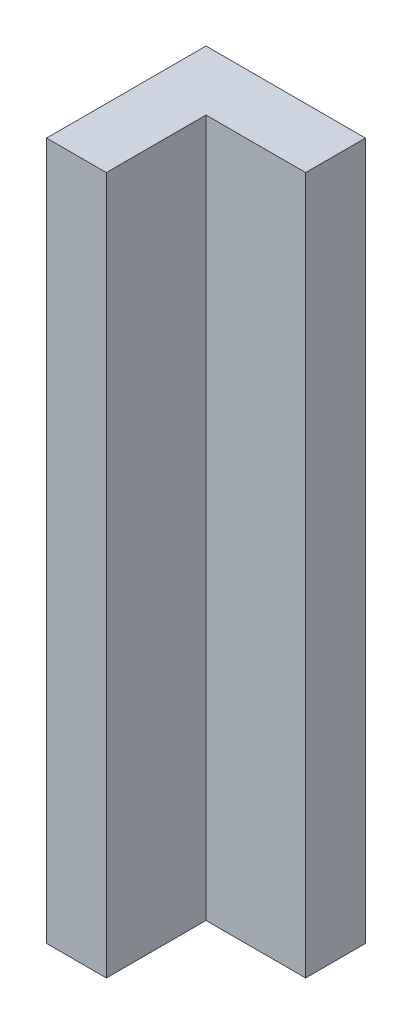
ISO-10303-21;
HEADER;
FILE_DESCRIPTION(('STEP AP214'),'2;1');
FILE_NAME('part.step','',(''),(''),'','','');
FILE_SCHEMA(('AUTOMOTIVE_DESIGN { 1 0 10303 214 1 1 1 1 }'));
ENDSEC;
DATA;
#1=APPLICATION_CONTEXT('core data for automotive mechanical design processes');
#2=APPLICATION_PROTOCOL_DEFINITION('international standard','automotive_design',2000,#1);
#3=PRODUCT_CONTEXT('',#1,'mechanical');
#4=PRODUCT('Part','Part','',(#3));
#5=PRODUCT_RELATED_PRODUCT_CATEGORY('part','',(#4));
#6=PRODUCT_DEFINITION_FORMATION('','',#4);
#7=PRODUCT_DEFINITION_CONTEXT('part definition',#1,'design');
#8=PRODUCT_DEFINITION('design','',#6,#7);
#9=PRODUCT_DEFINITION_SHAPE('','',#8);
#10=(LENGTH_UNIT() NAMED_UNIT(*) SI_UNIT(.MILLI.,.METRE.));
#11=(NAMED_UNIT(*) PLANE_ANGLE_UNIT() SI_UNIT($,.RADIAN.));
#12=(NAMED_UNIT(*) SI_UNIT($,.STERADIAN.) SOLID_ANGLE_UNIT());
#13=UNCERTAINTY_MEASURE_WITH_UNIT(LENGTH_MEASURE(1.E-05),#10,'distance_accuracy_value','');
#14=(GEOMETRIC_REPRESENTATION_CONTEXT(3) GLOBAL_UNCERTAINTY_ASSIGNED_CONTEXT((#13)) GLOBAL_UNIT_ASSIGNED_CONTEXT((#10,
#11,#12)) REPRESENTATION_CONTEXT('',''));
#15=CARTESIAN_POINT('',(0.,0.,0.));
#16=DIRECTION('',(0.,0.,1.));
#17=DIRECTION('',(1.,0.,0.));
#18=AXIS2_PLACEMENT_3D('',#15,#16,#17);
#19=CARTESIAN_POINT('',(5.68656716417911,56.,-6.66567164179104));
#20=DIRECTION('',(0.,0.,1.));
#21=DIRECTION('',(1.,0.,0.));
#22=AXIS2_PLACEMENT_3D('',#19,#20,#21);
#23=PLANE('',#22);
#24=DIRECTION('',(-1.,0.,0.));
#25=VECTOR('',#24,1.);
#26=CARTESIAN_POINT('',(5.68656716417911,0.,-6.66567164179104));
#27=LINE('',#26,#25);
#28=CARTESIAN_POINT('',(5.68656716417911,0.,-6.66567164179104));
#29=VERTEX_POINT('',#28);
#30=CARTESIAN_POINT('',(-7.11343283582089,0.,-6.66567164179104));
#31=VERTEX_POINT('',#30);
#32=EDGE_CURVE('E120',#29,#31,#27,.T.);
#33=ORIENTED_EDGE('',*,*,#32,.T.);
#34=DIRECTION('',(0.,-1.,0.));
#35=VECTOR('',#34,1.);
#36=CARTESIAN_POINT('',(-7.11343283582089,56.,-6.66567164179104));
#37=LINE('',#36,#35);
#38=CARTESIAN_POINT('',(-7.11343283582089,56.,-6.66567164179104));
#39=VERTEX_POINT('',#38);
#40=EDGE_CURVE('E11',#39,#31,#37,.T.);
#41=ORIENTED_EDGE('',*,*,#40,.F.);
#42=DIRECTION('',(-1.,0.,0.));
#43=VECTOR('',#42,1.);
#44=CARTESIAN_POINT('',(5.68656716417911,56.,-6.66567164179104));
#45=LINE('',#44,#43);
#46=CARTESIAN_POINT('',(5.68656716417911,56.,-6.66567164179104));
#47=VERTEX_POINT('',#46);
#48=EDGE_CURVE('E130',#47,#39,#45,.T.);
#49=ORIENTED_EDGE('',*,*,#48,.F.);
#50=DIRECTION('',(0.,-1.,0.));
#51=VECTOR('',#50,1.);
#52=CARTESIAN_POINT('',(5.68656716417911,56.,-6.66567164179104));
#53=LINE('',#52,#51);
#54=EDGE_CURVE('E116',#47,#29,#53,.T.);
#55=ORIENTED_EDGE('',*,*,#54,.T.);
#56=EDGE_LOOP('',(#33,#41,#49,#55));
#57=FACE_BOUND('',#56,.T.);
#58=ADVANCED_FACE('F36',(#57),#23,.F.);
#59=CARTESIAN_POINT('',(-7.11343283582089,56.,-6.66567164179104));
#60=DIRECTION('',(1.,0.,0.));
#61=DIRECTION('',(0.,0.,-1.));
#62=AXIS2_PLACEMENT_3D('',#59,#60,#61);
#63=PLANE('',#62);
#64=DIRECTION('',(0.,0.,1.));
#65=VECTOR('',#64,1.);
#66=CARTESIAN_POINT('',(-7.11343283582089,0.,-6.66567164179104));
#67=LINE('',#66,#65);
#68=CARTESIAN_POINT('',(-7.11343283582089,0.,6.13432835820896));
#69=VERTEX_POINT('',#68);
#70=EDGE_CURVE('E123',#31,#69,#67,.T.);
#71=ORIENTED_EDGE('',*,*,#70,.T.);
#72=DIRECTION('',(0.,-1.,0.));
#73=VECTOR('',#72,1.);
#74=CARTESIAN_POINT('',(-7.11343283582089,56.,6.13432835820896));
#75=LINE('',#74,#73);
#76=CARTESIAN_POINT('',(-7.11343283582089,56.,6.13432835820896));
#77=VERTEX_POINT('',#76);
#78=EDGE_CURVE('E44',#77,#69,#75,.T.);
#79=ORIENTED_EDGE('',*,*,#78,.F.);
#80=DIRECTION('',(0.,0.,1.));
#81=VECTOR('',#80,1.);
#82=CARTESIAN_POINT('',(-7.11343283582089,56.,-6.66567164179104));
#83=LINE('',#82,#81);
#84=EDGE_CURVE('E89',#39,#77,#83,.T.);
#85=ORIENTED_EDGE('',*,*,#84,.F.);
#86=ORIENTED_EDGE('',*,*,#40,.T.);
#87=EDGE_LOOP('',(#71,#79,#85,#86));
#88=FACE_BOUND('',#87,.T.);
#89=ADVANCED_FACE('F154',(#88),#63,.F.);
#90=CARTESIAN_POINT('',(-7.11343283582089,56.,6.13432835820896));
#91=DIRECTION('',(0.,0.,-1.));
#92=DIRECTION('',(-1.,0.,0.));
#93=AXIS2_PLACEMENT_3D('',#90,#91,#92);
#94=PLANE('',#93);
#95=DIRECTION('',(1.,0.,0.));
#96=VECTOR('',#95,1.);
#97=CARTESIAN_POINT('',(-7.11343283582089,0.,6.13432835820896));
#98=LINE('',#97,#96);
#99=CARTESIAN_POINT('',(-2.31343283582089,0.,6.13432835820896));
#100=VERTEX_POINT('',#99);
#101=EDGE_CURVE('E125',#69,#100,#98,.T.);
#102=ORIENTED_EDGE('',*,*,#101,.T.);
#103=DIRECTION('',(0.,-1.,0.));
#104=VECTOR('',#103,1.);
#105=CARTESIAN_POINT('',(-2.31343283582089,56.,6.13432835820896));
#106=LINE('',#105,#104);
#107=CARTESIAN_POINT('',(-2.31343283582089,56.,6.13432835820896));
#108=VERTEX_POINT('',#107);
#109=EDGE_CURVE('E111',#108,#100,#106,.T.);
#110=ORIENTED_EDGE('',*,*,#109,.F.);
#111=DIRECTION('',(1.,0.,0.));
#112=VECTOR('',#111,1.);
#113=CARTESIAN_POINT('',(-7.11343283582089,56.,6.13432835820896));
#114=LINE('',#113,#112);
#115=EDGE_CURVE('E102',#77,#108,#114,.T.);
#116=ORIENTED_EDGE('',*,*,#115,.F.);
#117=ORIENTED_EDGE('',*,*,#78,.T.);
#118=EDGE_LOOP('',(#102,#110,#116,#117));
#119=FACE_BOUND('',#118,.T.);
#120=ADVANCED_FACE('F136',(#119),#94,.F.);
#121=CARTESIAN_POINT('',(-2.31343283582089,56.,6.13432835820896));
#122=DIRECTION('',(-1.,0.,0.));
#123=DIRECTION('',(0.,0.,1.));
#124=AXIS2_PLACEMENT_3D('',#121,#122,#123);
#125=PLANE('',#124);
#126=DIRECTION('',(0.,0.,-1.));
#127=VECTOR('',#126,1.);
#128=CARTESIAN_POINT('',(-2.31343283582089,0.,6.13432835820896));
#129=LINE('',#128,#127);
#130=CARTESIAN_POINT('',(-2.31343283582089,0.,-1.86567164179104));
#131=VERTEX_POINT('',#130);
#132=EDGE_CURVE('E110',#100,#131,#129,.T.);
#133=ORIENTED_EDGE('',*,*,#132,.T.);
#134=DIRECTION('',(0.,-1.,0.));
#135=VECTOR('',#134,1.);
#136=CARTESIAN_POINT('',(-2.31343283582089,56.,-1.86567164179104));
#137=LINE('',#136,#135);
#138=CARTESIAN_POINT('',(-2.31343283582089,56.,-1.86567164179104));
#139=VERTEX_POINT('',#138);
#140=EDGE_CURVE('E107',#139,#131,#137,.T.);
#141=ORIENTED_EDGE('',*,*,#140,.F.);
#142=DIRECTION('',(0.,0.,-1.));
#143=VECTOR('',#142,1.);
#144=CARTESIAN_POINT('',(-2.31343283582089,56.,6.13432835820896));
#145=LINE('',#144,#143);
#146=EDGE_CURVE('E96',#108,#139,#145,.T.);
#147=ORIENTED_EDGE('',*,*,#146,.F.);
#148=ORIENTED_EDGE('',*,*,#109,.T.);
#149=EDGE_LOOP('',(#133,#141,#147,#148));
#150=FACE_BOUND('',#149,.T.);
#151=ADVANCED_FACE('F108',(#150),#125,.F.);
#152=CARTESIAN_POINT('',(-2.31343283582089,56.,-1.86567164179104));
#153=DIRECTION('',(0.,0.,-1.));
#154=DIRECTION('',(-1.,0.,0.));
#155=AXIS2_PLACEMENT_3D('',#152,#153,#154);
#156=PLANE('',#155);
#157=DIRECTION('',(1.,0.,0.));
#158=VECTOR('',#157,1.);
#159=CARTESIAN_POINT('',(-2.31343283582089,0.,-1.86567164179104));
#160=LINE('',#159,#158);
#161=CARTESIAN_POINT('',(5.68656716417911,0.,-1.86567164179104));
#162=VERTEX_POINT('',#161);
#163=EDGE_CURVE('E75',#131,#162,#160,.T.);
#164=ORIENTED_EDGE('',*,*,#163,.T.);
#165=DIRECTION('',(0.,-1.,0.));
#166=VECTOR('',#165,1.);
#167=CARTESIAN_POINT('',(5.68656716417911,56.,-1.86567164179104));
#168=LINE('',#167,#166);
#169=CARTESIAN_POINT('',(5.68656716417911,56.,-1.86567164179104));
#170=VERTEX_POINT('',#169);
#171=EDGE_CURVE('E112',#170,#162,#168,.T.);
#172=ORIENTED_EDGE('',*,*,#171,.F.);
#173=DIRECTION('',(1.,0.,0.));
#174=VECTOR('',#173,1.);
#175=CARTESIAN_POINT('',(-2.31343283582089,56.,-1.86567164179104));
#176=LINE('',#175,#174);
#177=EDGE_CURVE('E100',#139,#170,#176,.T.);
#178=ORIENTED_EDGE('',*,*,#177,.F.);
#179=ORIENTED_EDGE('',*,*,#140,.T.);
#180=EDGE_LOOP('',(#164,#172,#178,#179));
#181=FACE_BOUND('',#180,.T.);
#182=ADVANCED_FACE('F114',(#181),#156,.F.);
#183=CARTESIAN_POINT('',(5.68656716417911,56.,-1.86567164179104));
#184=DIRECTION('',(-1.,0.,0.));
#185=DIRECTION('',(0.,0.,1.));
#186=AXIS2_PLACEMENT_3D('',#183,#184,#185);
#187=PLANE('',#186);
#188=DIRECTION('',(0.,0.,-1.));
#189=VECTOR('',#188,1.);
#190=CARTESIAN_POINT('',(5.68656716417911,0.,-1.86567164179104));
#191=LINE('',#190,#189);
#192=EDGE_CURVE('E81',#162,#29,#191,.T.);
#193=ORIENTED_EDGE('',*,*,#192,.T.);
#194=ORIENTED_EDGE('',*,*,#54,.F.);
#195=DIRECTION('',(0.,0.,-1.));
#196=VECTOR('',#195,1.);
#197=CARTESIAN_POINT('',(5.68656716417911,56.,-1.86567164179104));
#198=LINE('',#197,#196);
#199=EDGE_CURVE('E52',#170,#47,#198,.T.);
#200=ORIENTED_EDGE('',*,*,#199,.F.);
#201=ORIENTED_EDGE('',*,*,#171,.T.);
#202=EDGE_LOOP('',(#193,#194,#200,#201));
#203=FACE_BOUND('',#202,.T.);
#204=ADVANCED_FACE('F143',(#203),#187,.F.);
#205=CARTESIAN_POINT('',(0.,56.,0.));
#206=DIRECTION('',(0.,1.,0.));
#207=DIRECTION('',(0.,0.,1.));
#208=AXIS2_PLACEMENT_3D('',#205,#206,#207);
#209=PLANE('',#208);
#210=ORIENTED_EDGE('',*,*,#48,.T.);
#211=ORIENTED_EDGE('',*,*,#84,.T.);
#212=ORIENTED_EDGE('',*,*,#115,.T.);
#213=ORIENTED_EDGE('',*,*,#146,.T.);
#214=ORIENTED_EDGE('',*,*,#177,.T.);
#215=ORIENTED_EDGE('',*,*,#199,.T.);
#216=EDGE_LOOP('',(#210,#211,#212,#213,#214,#215));
#217=FACE_BOUND('',#216,.T.);
#218=ADVANCED_FACE('F98',(#217),#209,.T.);
#219=CARTESIAN_POINT('',(0.,0.,0.));
#220=DIRECTION('',(0.,1.,0.));
#221=DIRECTION('',(0.,0.,1.));
#222=AXIS2_PLACEMENT_3D('',#219,#220,#221);
#223=PLANE('',#222);
#224=ORIENTED_EDGE('',*,*,#32,.F.);
#225=ORIENTED_EDGE('',*,*,#192,.F.);
#226=ORIENTED_EDGE('',*,*,#163,.F.);
#227=ORIENTED_EDGE('',*,*,#132,.F.);
#228=ORIENTED_EDGE('',*,*,#101,.F.);
#229=ORIENTED_EDGE('',*,*,#70,.F.);
#230=EDGE_LOOP('',(#224,#225,#226,#227,#228,#229));
#231=FACE_BOUND('',#230,.T.);
#232=ADVANCED_FACE('F139',(#231),#223,.F.);
#233=CLOSED_SHELL('',(#58,#89,#120,#151,#182,#204,#218,#232));
#234=MANIFOLD_SOLID_BREP('B2',#233);
#235=ADVANCED_BREP_SHAPE_REPRESENTATION('',(#18,#234),#14);
#236=SHAPE_DEFINITION_REPRESENTATION(#9,#235);
ENDSEC;
END-ISO-10303-21;
